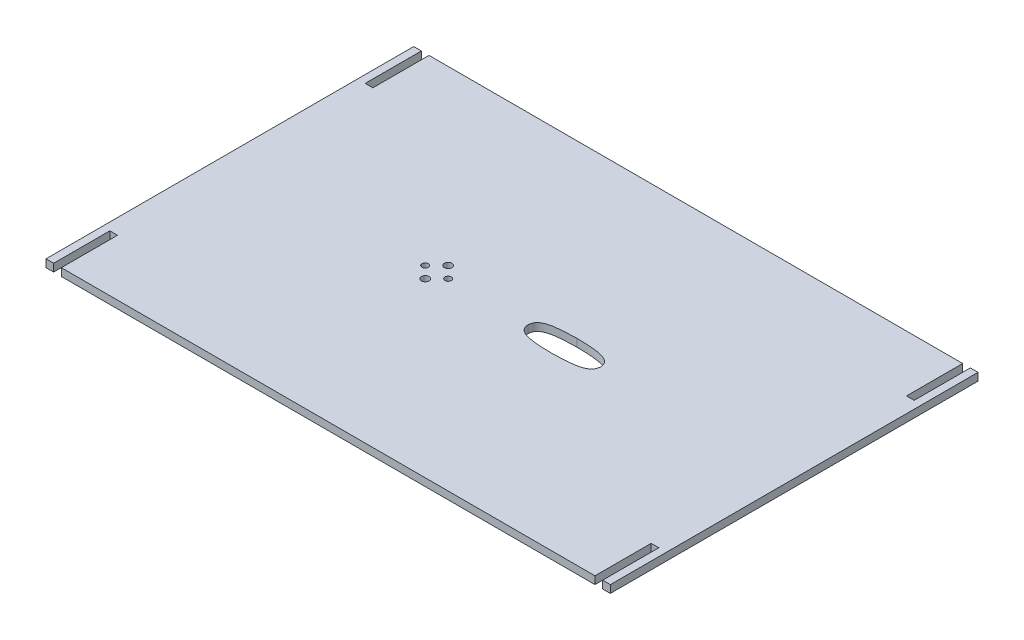
ISO-10303-21;
HEADER;
FILE_DESCRIPTION(('STEP AP214'),'2;1');
FILE_NAME('part.step','',(''),(''),'','','');
FILE_SCHEMA(('AUTOMOTIVE_DESIGN { 1 0 10303 214 1 1 1 1 }'));
ENDSEC;
DATA;
#1=APPLICATION_CONTEXT('core data for automotive mechanical design processes');
#2=APPLICATION_PROTOCOL_DEFINITION('international standard','automotive_design',2000,#1);
#3=PRODUCT_CONTEXT('',#1,'mechanical');
#4=PRODUCT('Part','Part','',(#3));
#5=PRODUCT_RELATED_PRODUCT_CATEGORY('part','',(#4));
#6=PRODUCT_DEFINITION_FORMATION('','',#4);
#7=PRODUCT_DEFINITION_CONTEXT('part definition',#1,'design');
#8=PRODUCT_DEFINITION('design','',#6,#7);
#9=PRODUCT_DEFINITION_SHAPE('','',#8);
#10=(LENGTH_UNIT() NAMED_UNIT(*) SI_UNIT(.MILLI.,.METRE.));
#11=(NAMED_UNIT(*) PLANE_ANGLE_UNIT() SI_UNIT($,.RADIAN.));
#12=(NAMED_UNIT(*) SI_UNIT($,.STERADIAN.) SOLID_ANGLE_UNIT());
#13=UNCERTAINTY_MEASURE_WITH_UNIT(LENGTH_MEASURE(1.E-05),#10,'distance_accuracy_value','');
#14=(GEOMETRIC_REPRESENTATION_CONTEXT(3) GLOBAL_UNCERTAINTY_ASSIGNED_CONTEXT((#13)) GLOBAL_UNIT_ASSIGNED_CONTEXT((#10,
#11,#12)) REPRESENTATION_CONTEXT('',''));
#15=CARTESIAN_POINT('',(0.,0.,0.));
#16=DIRECTION('',(0.,0.,1.));
#17=DIRECTION('',(1.,0.,0.));
#18=AXIS2_PLACEMENT_3D('',#15,#16,#17);
#19=CARTESIAN_POINT('',(3.14071685325601E-11,6.,-43.9999999999758));
#20=DIRECTION('',(1.,0.,0.));
#21=DIRECTION('',(0.,0.,-1.));
#22=AXIS2_PLACEMENT_3D('',#19,#20,#21);
#23=PLANE('',#22);
#24=DIRECTION('',(0.,0.,1.));
#25=VECTOR('',#24,1.);
#26=CARTESIAN_POINT('',(3.14071685325601E-11,0.,-43.9999999999758));
#27=LINE('',#26,#25);
#28=CARTESIAN_POINT('',(3.14071685325601E-11,0.,-43.9999999999758));
#29=VERTEX_POINT('',#28);
#30=CARTESIAN_POINT('',(3.14124717823535E-11,0.,-1.20459198171829E-11));
#31=VERTEX_POINT('',#30);
#32=EDGE_CURVE('E366',#29,#31,#27,.T.);
#33=ORIENTED_EDGE('',*,*,#32,.T.);
#34=DIRECTION('',(0.,-1.,0.));
#35=VECTOR('',#34,1.);
#36=CARTESIAN_POINT('',(3.14124717823535E-11,6.,-1.20459198171829E-11));
#37=LINE('',#36,#35);
#38=CARTESIAN_POINT('',(3.14124717823535E-11,6.,-1.20459198171829E-11));
#39=VERTEX_POINT('',#38);
#40=EDGE_CURVE('E11',#39,#31,#37,.T.);
#41=ORIENTED_EDGE('',*,*,#40,.F.);
#42=DIRECTION('',(0.,0.,1.));
#43=VECTOR('',#42,1.);
#44=CARTESIAN_POINT('',(3.14071685325601E-11,6.,-43.9999999999758));
#45=LINE('',#44,#43);
#46=CARTESIAN_POINT('',(3.14071685325601E-11,6.,-43.9999999999758));
#47=VERTEX_POINT('',#46);
#48=EDGE_CURVE('E411',#47,#39,#45,.T.);
#49=ORIENTED_EDGE('',*,*,#48,.F.);
#50=DIRECTION('',(0.,-1.,0.));
#51=VECTOR('',#50,1.);
#52=CARTESIAN_POINT('',(3.14071685325601E-11,6.,-43.9999999999758));
#53=LINE('',#52,#51);
#54=EDGE_CURVE('E412',#47,#29,#53,.T.);
#55=ORIENTED_EDGE('',*,*,#54,.T.);
#56=EDGE_LOOP('',(#33,#41,#49,#55));
#57=FACE_BOUND('',#56,.T.);
#58=ADVANCED_FACE('F43',(#57),#23,.F.);
#59=CARTESIAN_POINT('',(3.14124717823535E-11,6.,-1.20459198171829E-11));
#60=DIRECTION('',(0.,0.,-1.));
#61=DIRECTION('',(-1.,0.,0.));
#62=AXIS2_PLACEMENT_3D('',#59,#60,#61);
#63=PLANE('',#62);
#64=DIRECTION('',(1.,0.,0.));
#65=VECTOR('',#64,1.);
#66=CARTESIAN_POINT('',(3.14124717823535E-11,0.,-1.20459198171829E-11));
#67=LINE('',#66,#65);
#68=CARTESIAN_POINT('',(418.000000000031,0.,0.));
#69=VERTEX_POINT('',#68);
#70=EDGE_CURVE('E357',#31,#69,#67,.T.);
#71=ORIENTED_EDGE('',*,*,#70,.T.);
#72=DIRECTION('',(0.,-1.,0.));
#73=VECTOR('',#72,1.);
#74=CARTESIAN_POINT('',(418.000000000031,6.,0.));
#75=LINE('',#74,#73);
#76=CARTESIAN_POINT('',(418.000000000031,6.,0.));
#77=VERTEX_POINT('',#76);
#78=EDGE_CURVE('E50',#77,#69,#75,.T.);
#79=ORIENTED_EDGE('',*,*,#78,.F.);
#80=DIRECTION('',(1.,0.,0.));
#81=VECTOR('',#80,1.);
#82=CARTESIAN_POINT('',(3.14124717823535E-11,6.,-1.20459198171829E-11));
#83=LINE('',#82,#81);
#84=EDGE_CURVE('E473',#39,#77,#83,.T.);
#85=ORIENTED_EDGE('',*,*,#84,.F.);
#86=ORIENTED_EDGE('',*,*,#40,.T.);
#87=EDGE_LOOP('',(#71,#79,#85,#86));
#88=FACE_BOUND('',#87,.T.);
#89=ADVANCED_FACE('F348',(#88),#63,.F.);
#90=CARTESIAN_POINT('',(418.000000000031,6.,0.));
#91=DIRECTION('',(-1.,0.,0.));
#92=DIRECTION('',(0.,0.,1.));
#93=AXIS2_PLACEMENT_3D('',#90,#91,#92);
#94=PLANE('',#93);
#95=DIRECTION('',(0.,0.,-1.));
#96=VECTOR('',#95,1.);
#97=CARTESIAN_POINT('',(418.000000000031,0.,0.));
#98=LINE('',#97,#96);
#99=CARTESIAN_POINT('',(418.000000000031,0.,-43.9999999999761));
#100=VERTEX_POINT('',#99);
#101=EDGE_CURVE('E365',#69,#100,#98,.T.);
#102=ORIENTED_EDGE('',*,*,#101,.T.);
#103=DIRECTION('',(0.,-1.,0.));
#104=VECTOR('',#103,1.);
#105=CARTESIAN_POINT('',(418.000000000031,6.,-43.9999999999761));
#106=LINE('',#105,#104);
#107=CARTESIAN_POINT('',(418.000000000031,6.,-43.9999999999761));
#108=VERTEX_POINT('',#107);
#109=EDGE_CURVE('E371',#108,#100,#106,.T.);
#110=ORIENTED_EDGE('',*,*,#109,.F.);
#111=DIRECTION('',(0.,0.,-1.));
#112=VECTOR('',#111,1.);
#113=CARTESIAN_POINT('',(418.000000000031,6.,0.));
#114=LINE('',#113,#112);
#115=EDGE_CURVE('E370',#77,#108,#114,.T.);
#116=ORIENTED_EDGE('',*,*,#115,.F.);
#117=ORIENTED_EDGE('',*,*,#78,.T.);
#118=EDGE_LOOP('',(#102,#110,#116,#117));
#119=FACE_BOUND('',#118,.T.);
#120=ADVANCED_FACE('F345',(#119),#94,.F.);
#121=CARTESIAN_POINT('',(423.999999999984,6.,-43.9999999999761));
#122=DIRECTION('',(0.,0.,-1.));
#123=DIRECTION('',(-1.,0.,0.));
#124=AXIS2_PLACEMENT_3D('',#121,#122,#123);
#125=PLANE('',#124);
#126=DIRECTION('',(1.,0.,0.));
#127=VECTOR('',#126,1.);
#128=CARTESIAN_POINT('',(423.999999999984,0.,-43.9999999999761));
#129=LINE('',#128,#127);
#130=CARTESIAN_POINT('',(423.999999999984,0.,-43.9999999999761));
#131=VERTEX_POINT('',#130);
#132=EDGE_CURVE('E374',#100,#131,#129,.T.);
#133=ORIENTED_EDGE('',*,*,#132,.T.);
#134=DIRECTION('',(0.,-1.,0.));
#135=VECTOR('',#134,1.);
#136=CARTESIAN_POINT('',(423.999999999984,6.,-43.9999999999761));
#137=LINE('',#136,#135);
#138=CARTESIAN_POINT('',(423.999999999984,6.,-43.9999999999761));
#139=VERTEX_POINT('',#138);
#140=EDGE_CURVE('E461',#139,#131,#137,.T.);
#141=ORIENTED_EDGE('',*,*,#140,.F.);
#142=DIRECTION('',(1.,0.,0.));
#143=VECTOR('',#142,1.);
#144=CARTESIAN_POINT('',(423.999999999984,6.,-43.9999999999761));
#145=LINE('',#144,#143);
#146=EDGE_CURVE('E466',#108,#139,#145,.T.);
#147=ORIENTED_EDGE('',*,*,#146,.F.);
#148=ORIENTED_EDGE('',*,*,#109,.T.);
#149=EDGE_LOOP('',(#133,#141,#147,#148));
#150=FACE_BOUND('',#149,.T.);
#151=ADVANCED_FACE('F341',(#150),#125,.F.);
#152=CARTESIAN_POINT('',(423.999999999984,6.,-1.23267613517096E-13));
#153=DIRECTION('',(1.,0.,0.));
#154=DIRECTION('',(0.,0.,-1.));
#155=AXIS2_PLACEMENT_3D('',#152,#153,#154);
#156=PLANE('',#155);
#157=DIRECTION('',(0.,0.,1.));
#158=VECTOR('',#157,1.);
#159=CARTESIAN_POINT('',(423.999999999984,0.,-1.23267613517096E-13));
#160=LINE('',#159,#158);
#161=CARTESIAN_POINT('',(423.999999999984,0.,-1.23267613517096E-13));
#162=VERTEX_POINT('',#161);
#163=EDGE_CURVE('E376',#131,#162,#160,.T.);
#164=ORIENTED_EDGE('',*,*,#163,.T.);
#165=DIRECTION('',(0.,-1.,0.));
#166=VECTOR('',#165,1.);
#167=CARTESIAN_POINT('',(423.999999999984,6.,-1.23267613517096E-13));
#168=LINE('',#167,#166);
#169=CARTESIAN_POINT('',(423.999999999984,6.,-1.23267613517096E-13));
#170=VERTEX_POINT('',#169);
#171=EDGE_CURVE('E458',#170,#162,#168,.T.);
#172=ORIENTED_EDGE('',*,*,#171,.F.);
#173=DIRECTION('',(0.,0.,1.));
#174=VECTOR('',#173,1.);
#175=CARTESIAN_POINT('',(423.999999999984,6.,-1.23267613517096E-13));
#176=LINE('',#175,#174);
#177=EDGE_CURVE('E469',#139,#170,#176,.T.);
#178=ORIENTED_EDGE('',*,*,#177,.F.);
#179=ORIENTED_EDGE('',*,*,#140,.T.);
#180=EDGE_LOOP('',(#164,#172,#178,#179));
#181=FACE_BOUND('',#180,.T.);
#182=ADVANCED_FACE('F337',(#181),#156,.F.);
#183=CARTESIAN_POINT('',(429.999999999984,6.,0.));
#184=DIRECTION('',(0.,0.,-1.));
#185=DIRECTION('',(-1.,0.,0.));
#186=AXIS2_PLACEMENT_3D('',#183,#184,#185);
#187=PLANE('',#186);
#188=DIRECTION('',(1.,0.,0.));
#189=VECTOR('',#188,1.);
#190=CARTESIAN_POINT('',(429.999999999984,0.,0.));
#191=LINE('',#190,#189);
#192=CARTESIAN_POINT('',(429.999999999984,0.,0.));
#193=VERTEX_POINT('',#192);
#194=EDGE_CURVE('E381',#162,#193,#191,.T.);
#195=ORIENTED_EDGE('',*,*,#194,.T.);
#196=DIRECTION('',(0.,-1.,0.));
#197=VECTOR('',#196,1.);
#198=CARTESIAN_POINT('',(429.999999999984,6.,0.));
#199=LINE('',#198,#197);
#200=CARTESIAN_POINT('',(429.999999999984,6.,0.));
#201=VERTEX_POINT('',#200);
#202=EDGE_CURVE('E455',#201,#193,#199,.T.);
#203=ORIENTED_EDGE('',*,*,#202,.F.);
#204=DIRECTION('',(1.,0.,0.));
#205=VECTOR('',#204,1.);
#206=CARTESIAN_POINT('',(429.999999999984,6.,0.));
#207=LINE('',#206,#205);
#208=EDGE_CURVE('E471',#170,#201,#207,.T.);
#209=ORIENTED_EDGE('',*,*,#208,.F.);
#210=ORIENTED_EDGE('',*,*,#171,.T.);
#211=EDGE_LOOP('',(#195,#203,#209,#210));
#212=FACE_BOUND('',#211,.T.);
#213=ADVANCED_FACE('F333',(#212),#187,.F.);
#214=CARTESIAN_POINT('',(429.999999999984,6.,-287.999999999946));
#215=DIRECTION('',(-1.,0.,0.));
#216=DIRECTION('',(0.,0.,1.));
#217=AXIS2_PLACEMENT_3D('',#214,#215,#216);
#218=PLANE('',#217);
#219=DIRECTION('',(0.,0.,-1.));
#220=VECTOR('',#219,1.);
#221=CARTESIAN_POINT('',(429.999999999984,0.,-287.999999999946));
#222=LINE('',#221,#220);
#223=CARTESIAN_POINT('',(429.999999999984,0.,-287.999999999946));
#224=VERTEX_POINT('',#223);
#225=EDGE_CURVE('E383',#193,#224,#222,.T.);
#226=ORIENTED_EDGE('',*,*,#225,.T.);
#227=DIRECTION('',(0.,-1.,0.));
#228=VECTOR('',#227,1.);
#229=CARTESIAN_POINT('',(429.999999999984,6.,-287.999999999946));
#230=LINE('',#229,#228);
#231=CARTESIAN_POINT('',(429.999999999984,6.,-287.999999999946));
#232=VERTEX_POINT('',#231);
#233=EDGE_CURVE('E452',#232,#224,#230,.T.);
#234=ORIENTED_EDGE('',*,*,#233,.F.);
#235=DIRECTION('',(0.,0.,-1.));
#236=VECTOR('',#235,1.);
#237=CARTESIAN_POINT('',(429.999999999984,6.,-287.999999999946));
#238=LINE('',#237,#236);
#239=EDGE_CURVE('E478',#201,#232,#238,.T.);
#240=ORIENTED_EDGE('',*,*,#239,.F.);
#241=ORIENTED_EDGE('',*,*,#202,.T.);
#242=EDGE_LOOP('',(#226,#234,#240,#241));
#243=FACE_BOUND('',#242,.T.);
#244=ADVANCED_FACE('F329',(#243),#218,.F.);
#245=CARTESIAN_POINT('',(423.999999999984,6.,-287.999999999946));
#246=DIRECTION('',(0.,0.,1.));
#247=DIRECTION('',(1.,0.,0.));
#248=AXIS2_PLACEMENT_3D('',#245,#246,#247);
#249=PLANE('',#248);
#250=DIRECTION('',(-1.,0.,0.));
#251=VECTOR('',#250,1.);
#252=CARTESIAN_POINT('',(423.999999999984,0.,-287.999999999946));
#253=LINE('',#252,#251);
#254=CARTESIAN_POINT('',(423.999999999984,0.,-287.999999999946));
#255=VERTEX_POINT('',#254);
#256=EDGE_CURVE('E385',#224,#255,#253,.T.);
#257=ORIENTED_EDGE('',*,*,#256,.T.);
#258=DIRECTION('',(0.,-1.,0.));
#259=VECTOR('',#258,1.);
#260=CARTESIAN_POINT('',(423.999999999984,6.,-287.999999999946));
#261=LINE('',#260,#259);
#262=CARTESIAN_POINT('',(423.999999999984,6.,-287.999999999946));
#263=VERTEX_POINT('',#262);
#264=EDGE_CURVE('E449',#263,#255,#261,.T.);
#265=ORIENTED_EDGE('',*,*,#264,.F.);
#266=DIRECTION('',(-1.,0.,0.));
#267=VECTOR('',#266,1.);
#268=CARTESIAN_POINT('',(423.999999999984,6.,-287.999999999946));
#269=LINE('',#268,#267);
#270=EDGE_CURVE('E480',#232,#263,#269,.T.);
#271=ORIENTED_EDGE('',*,*,#270,.F.);
#272=ORIENTED_EDGE('',*,*,#233,.T.);
#273=EDGE_LOOP('',(#257,#265,#271,#272));
#274=FACE_BOUND('',#273,.T.);
#275=ADVANCED_FACE('F325',(#274),#249,.F.);
#276=CARTESIAN_POINT('',(423.999999999984,6.,-243.99999999997));
#277=DIRECTION('',(1.,0.,0.));
#278=DIRECTION('',(0.,0.,-1.));
#279=AXIS2_PLACEMENT_3D('',#276,#277,#278);
#280=PLANE('',#279);
#281=DIRECTION('',(0.,0.,1.));
#282=VECTOR('',#281,1.);
#283=CARTESIAN_POINT('',(423.999999999984,0.,-243.99999999997));
#284=LINE('',#283,#282);
#285=CARTESIAN_POINT('',(423.999999999984,0.,-243.99999999997));
#286=VERTEX_POINT('',#285);
#287=EDGE_CURVE('E387',#255,#286,#284,.T.);
#288=ORIENTED_EDGE('',*,*,#287,.T.);
#289=DIRECTION('',(0.,-1.,0.));
#290=VECTOR('',#289,1.);
#291=CARTESIAN_POINT('',(423.999999999984,6.,-243.99999999997));
#292=LINE('',#291,#290);
#293=CARTESIAN_POINT('',(423.999999999984,6.,-243.99999999997));
#294=VERTEX_POINT('',#293);
#295=EDGE_CURVE('E446',#294,#286,#292,.T.);
#296=ORIENTED_EDGE('',*,*,#295,.F.);
#297=DIRECTION('',(0.,0.,1.));
#298=VECTOR('',#297,1.);
#299=CARTESIAN_POINT('',(423.999999999984,6.,-243.99999999997));
#300=LINE('',#299,#298);
#301=EDGE_CURVE('E482',#263,#294,#300,.T.);
#302=ORIENTED_EDGE('',*,*,#301,.F.);
#303=ORIENTED_EDGE('',*,*,#264,.T.);
#304=EDGE_LOOP('',(#288,#296,#302,#303));
#305=FACE_BOUND('',#304,.T.);
#306=ADVANCED_FACE('F321',(#305),#280,.F.);
#307=CARTESIAN_POINT('',(417.999999999968,6.,-243.99999999997));
#308=DIRECTION('',(0.,0.,1.));
#309=DIRECTION('',(1.,0.,0.));
#310=AXIS2_PLACEMENT_3D('',#307,#308,#309);
#311=PLANE('',#310);
#312=DIRECTION('',(-1.,0.,0.));
#313=VECTOR('',#312,1.);
#314=CARTESIAN_POINT('',(417.999999999968,0.,-243.99999999997));
#315=LINE('',#314,#313);
#316=CARTESIAN_POINT('',(417.999999999968,0.,-243.99999999997));
#317=VERTEX_POINT('',#316);
#318=EDGE_CURVE('E389',#286,#317,#315,.T.);
#319=ORIENTED_EDGE('',*,*,#318,.T.);
#320=DIRECTION('',(0.,-1.,0.));
#321=VECTOR('',#320,1.);
#322=CARTESIAN_POINT('',(417.999999999968,6.,-243.99999999997));
#323=LINE('',#322,#321);
#324=CARTESIAN_POINT('',(417.999999999968,6.,-243.99999999997));
#325=VERTEX_POINT('',#324);
#326=EDGE_CURVE('E443',#325,#317,#323,.T.);
#327=ORIENTED_EDGE('',*,*,#326,.F.);
#328=DIRECTION('',(-1.,0.,0.));
#329=VECTOR('',#328,1.);
#330=CARTESIAN_POINT('',(417.999999999968,6.,-243.99999999997));
#331=LINE('',#330,#329);
#332=EDGE_CURVE('E484',#294,#325,#331,.T.);
#333=ORIENTED_EDGE('',*,*,#332,.F.);
#334=ORIENTED_EDGE('',*,*,#295,.T.);
#335=EDGE_LOOP('',(#319,#327,#333,#334));
#336=FACE_BOUND('',#335,.T.);
#337=ADVANCED_FACE('F317',(#336),#311,.F.);
#338=CARTESIAN_POINT('',(417.999999999968,6.,-243.99999999997));
#339=DIRECTION('',(-1.,0.,0.));
#340=DIRECTION('',(0.,0.,1.));
#341=AXIS2_PLACEMENT_3D('',#338,#339,#340);
#342=PLANE('',#341);
#343=DIRECTION('',(0.,0.,-1.));
#344=VECTOR('',#343,1.);
#345=CARTESIAN_POINT('',(417.999999999968,0.,-243.99999999997));
#346=LINE('',#345,#344);
#347=CARTESIAN_POINT('',(417.999999999968,0.,-287.999999999946));
#348=VERTEX_POINT('',#347);
#349=EDGE_CURVE('E391',#317,#348,#346,.T.);
#350=ORIENTED_EDGE('',*,*,#349,.T.);
#351=DIRECTION('',(0.,-1.,0.));
#352=VECTOR('',#351,1.);
#353=CARTESIAN_POINT('',(417.999999999968,6.,-287.999999999946));
#354=LINE('',#353,#352);
#355=CARTESIAN_POINT('',(417.999999999968,6.,-287.999999999946));
#356=VERTEX_POINT('',#355);
#357=EDGE_CURVE('E440',#356,#348,#354,.T.);
#358=ORIENTED_EDGE('',*,*,#357,.F.);
#359=DIRECTION('',(0.,0.,-1.));
#360=VECTOR('',#359,1.);
#361=CARTESIAN_POINT('',(417.999999999968,6.,-243.99999999997));
#362=LINE('',#361,#360);
#363=EDGE_CURVE('E486',#325,#356,#362,.T.);
#364=ORIENTED_EDGE('',*,*,#363,.F.);
#365=ORIENTED_EDGE('',*,*,#326,.T.);
#366=EDGE_LOOP('',(#350,#358,#364,#365));
#367=FACE_BOUND('',#366,.T.);
#368=ADVANCED_FACE('F313',(#367),#342,.F.);
#369=CARTESIAN_POINT('',(-3.18105047136071E-11,6.,-287.999999999946));
#370=DIRECTION('',(0.,0.,1.));
#371=DIRECTION('',(1.,0.,0.));
#372=AXIS2_PLACEMENT_3D('',#369,#370,#371);
#373=PLANE('',#372);
#374=DIRECTION('',(-1.,0.,0.));
#375=VECTOR('',#374,1.);
#376=CARTESIAN_POINT('',(-3.18105047136071E-11,0.,-287.999999999946));
#377=LINE('',#376,#375);
#378=CARTESIAN_POINT('',(-3.18105047136071E-11,0.,-287.999999999946));
#379=VERTEX_POINT('',#378);
#380=EDGE_CURVE('E393',#348,#379,#377,.T.);
#381=ORIENTED_EDGE('',*,*,#380,.T.);
#382=DIRECTION('',(0.,-1.,0.));
#383=VECTOR('',#382,1.);
#384=CARTESIAN_POINT('',(-3.18105047136071E-11,6.,-287.999999999946));
#385=LINE('',#384,#383);
#386=CARTESIAN_POINT('',(-3.18105047136071E-11,6.,-287.999999999946));
#387=VERTEX_POINT('',#386);
#388=EDGE_CURVE('E437',#387,#379,#385,.T.);
#389=ORIENTED_EDGE('',*,*,#388,.F.);
#390=DIRECTION('',(-1.,0.,0.));
#391=VECTOR('',#390,1.);
#392=CARTESIAN_POINT('',(-3.18105047136071E-11,6.,-287.999999999946));
#393=LINE('',#392,#391);
#394=EDGE_CURVE('E488',#356,#387,#393,.T.);
#395=ORIENTED_EDGE('',*,*,#394,.F.);
#396=ORIENTED_EDGE('',*,*,#357,.T.);
#397=EDGE_LOOP('',(#381,#389,#395,#396));
#398=FACE_BOUND('',#397,.T.);
#399=ADVANCED_FACE('F309',(#398),#373,.F.);
#400=CARTESIAN_POINT('',(-3.18105047136071E-11,6.,-287.999999999946));
#401=DIRECTION('',(1.,0.,0.));
#402=DIRECTION('',(0.,0.,-1.));
#403=AXIS2_PLACEMENT_3D('',#400,#401,#402);
#404=PLANE('',#403);
#405=DIRECTION('',(0.,0.,1.));
#406=VECTOR('',#405,1.);
#407=CARTESIAN_POINT('',(-3.18105047136071E-11,0.,-287.999999999946));
#408=LINE('',#407,#406);
#409=CARTESIAN_POINT('',(-3.18051162676908E-11,0.,-243.999999999724));
#410=VERTEX_POINT('',#409);
#411=EDGE_CURVE('E395',#379,#410,#408,.T.);
#412=ORIENTED_EDGE('',*,*,#411,.T.);
#413=DIRECTION('',(0.,-1.,0.));
#414=VECTOR('',#413,1.);
#415=CARTESIAN_POINT('',(-3.18051162676908E-11,6.,-243.999999999724));
#416=LINE('',#415,#414);
#417=CARTESIAN_POINT('',(-3.18051162676908E-11,6.,-243.999999999724));
#418=VERTEX_POINT('',#417);
#419=EDGE_CURVE('E434',#418,#410,#416,.T.);
#420=ORIENTED_EDGE('',*,*,#419,.F.);
#421=DIRECTION('',(0.,0.,1.));
#422=VECTOR('',#421,1.);
#423=CARTESIAN_POINT('',(-3.18105047136071E-11,6.,-287.999999999946));
#424=LINE('',#423,#422);
#425=EDGE_CURVE('E490',#387,#418,#424,.T.);
#426=ORIENTED_EDGE('',*,*,#425,.F.);
#427=ORIENTED_EDGE('',*,*,#388,.T.);
#428=EDGE_LOOP('',(#412,#420,#426,#427));
#429=FACE_BOUND('',#428,.T.);
#430=ADVANCED_FACE('F305',(#429),#404,.F.);
#431=CARTESIAN_POINT('',(-3.18051162676908E-11,6.,-243.999999999724));
#432=DIRECTION('',(0.,0.,1.));
#433=DIRECTION('',(1.,0.,0.));
#434=AXIS2_PLACEMENT_3D('',#431,#432,#433);
#435=PLANE('',#434);
#436=DIRECTION('',(-1.,0.,0.));
#437=VECTOR('',#436,1.);
#438=CARTESIAN_POINT('',(-3.18051162676908E-11,0.,-243.999999999724));
#439=LINE('',#438,#437);
#440=CARTESIAN_POINT('',(-6.0000000000478,0.,-243.999999999724));
#441=VERTEX_POINT('',#440);
#442=EDGE_CURVE('E397',#410,#441,#439,.T.);
#443=ORIENTED_EDGE('',*,*,#442,.T.);
#444=DIRECTION('',(0.,-1.,0.));
#445=VECTOR('',#444,1.);
#446=CARTESIAN_POINT('',(-6.0000000000478,6.,-243.999999999724));
#447=LINE('',#446,#445);
#448=CARTESIAN_POINT('',(-6.0000000000478,6.,-243.999999999724));
#449=VERTEX_POINT('',#448);
#450=EDGE_CURVE('E431',#449,#441,#447,.T.);
#451=ORIENTED_EDGE('',*,*,#450,.F.);
#452=DIRECTION('',(-1.,0.,0.));
#453=VECTOR('',#452,1.);
#454=CARTESIAN_POINT('',(-3.18051162676908E-11,6.,-243.999999999724));
#455=LINE('',#454,#453);
#456=EDGE_CURVE('E492',#418,#449,#455,.T.);
#457=ORIENTED_EDGE('',*,*,#456,.F.);
#458=ORIENTED_EDGE('',*,*,#419,.T.);
#459=EDGE_LOOP('',(#443,#451,#457,#458));
#460=FACE_BOUND('',#459,.T.);
#461=ADVANCED_FACE('F301',(#460),#435,.F.);
#462=CARTESIAN_POINT('',(-6.0000000000478,6.,-243.999999999724));
#463=DIRECTION('',(-1.,0.,0.));
#464=DIRECTION('',(0.,0.,1.));
#465=AXIS2_PLACEMENT_3D('',#462,#463,#464);
#466=PLANE('',#465);
#467=DIRECTION('',(0.,0.,-1.));
#468=VECTOR('',#467,1.);
#469=CARTESIAN_POINT('',(-6.0000000000478,0.,-243.999999999724));
#470=LINE('',#469,#468);
#471=CARTESIAN_POINT('',(-6.0000000000478,0.,-287.999999999946));
#472=VERTEX_POINT('',#471);
#473=EDGE_CURVE('E399',#441,#472,#470,.T.);
#474=ORIENTED_EDGE('',*,*,#473,.T.);
#475=DIRECTION('',(0.,-1.,0.));
#476=VECTOR('',#475,1.);
#477=CARTESIAN_POINT('',(-6.0000000000478,6.,-287.999999999946));
#478=LINE('',#477,#476);
#479=CARTESIAN_POINT('',(-6.0000000000478,6.,-287.999999999946));
#480=VERTEX_POINT('',#479);
#481=EDGE_CURVE('E428',#480,#472,#478,.T.);
#482=ORIENTED_EDGE('',*,*,#481,.F.);
#483=DIRECTION('',(0.,0.,-1.));
#484=VECTOR('',#483,1.);
#485=CARTESIAN_POINT('',(-6.0000000000478,6.,-243.999999999724));
#486=LINE('',#485,#484);
#487=EDGE_CURVE('E494',#449,#480,#486,.T.);
#488=ORIENTED_EDGE('',*,*,#487,.F.);
#489=ORIENTED_EDGE('',*,*,#450,.T.);
#490=EDGE_LOOP('',(#474,#482,#488,#489));
#491=FACE_BOUND('',#490,.T.);
#492=ADVANCED_FACE('F297',(#491),#466,.F.);
#493=CARTESIAN_POINT('',(-6.0000000000478,6.,-287.999999999946));
#494=DIRECTION('',(0.,0.,1.));
#495=DIRECTION('',(1.,0.,0.));
#496=AXIS2_PLACEMENT_3D('',#493,#494,#495);
#497=PLANE('',#496);
#498=DIRECTION('',(-1.,0.,0.));
#499=VECTOR('',#498,1.);
#500=CARTESIAN_POINT('',(-6.0000000000478,0.,-287.999999999946));
#501=LINE('',#500,#499);
#502=CARTESIAN_POINT('',(-12.0000000000478,0.,-287.999999999946));
#503=VERTEX_POINT('',#502);
#504=EDGE_CURVE('E401',#472,#503,#501,.T.);
#505=ORIENTED_EDGE('',*,*,#504,.T.);
#506=DIRECTION('',(0.,-1.,0.));
#507=VECTOR('',#506,1.);
#508=CARTESIAN_POINT('',(-12.0000000000478,6.,-287.999999999946));
#509=LINE('',#508,#507);
#510=CARTESIAN_POINT('',(-12.0000000000478,6.,-287.999999999946));
#511=VERTEX_POINT('',#510);
#512=EDGE_CURVE('E425',#511,#503,#509,.T.);
#513=ORIENTED_EDGE('',*,*,#512,.F.);
#514=DIRECTION('',(-1.,0.,0.));
#515=VECTOR('',#514,1.);
#516=CARTESIAN_POINT('',(-6.0000000000478,6.,-287.999999999946));
#517=LINE('',#516,#515);
#518=EDGE_CURVE('E496',#480,#511,#517,.T.);
#519=ORIENTED_EDGE('',*,*,#518,.F.);
#520=ORIENTED_EDGE('',*,*,#481,.T.);
#521=EDGE_LOOP('',(#505,#513,#519,#520));
#522=FACE_BOUND('',#521,.T.);
#523=ADVANCED_FACE('F293',(#522),#497,.F.);
#524=CARTESIAN_POINT('',(-12.0000000000478,6.,-287.999999999946));
#525=DIRECTION('',(1.,0.,0.));
#526=DIRECTION('',(0.,0.,-1.));
#527=AXIS2_PLACEMENT_3D('',#524,#525,#526);
#528=PLANE('',#527);
#529=DIRECTION('',(0.,0.,1.));
#530=VECTOR('',#529,1.);
#531=CARTESIAN_POINT('',(-12.0000000000478,0.,-287.999999999946));
#532=LINE('',#531,#530);
#533=CARTESIAN_POINT('',(-12.0000000000478,0.,0.));
#534=VERTEX_POINT('',#533);
#535=EDGE_CURVE('E403',#503,#534,#532,.T.);
#536=ORIENTED_EDGE('',*,*,#535,.T.);
#537=DIRECTION('',(0.,-1.,0.));
#538=VECTOR('',#537,1.);
#539=CARTESIAN_POINT('',(-12.0000000000478,6.,0.));
#540=LINE('',#539,#538);
#541=CARTESIAN_POINT('',(-12.0000000000478,6.,0.));
#542=VERTEX_POINT('',#541);
#543=EDGE_CURVE('E422',#542,#534,#540,.T.);
#544=ORIENTED_EDGE('',*,*,#543,.F.);
#545=DIRECTION('',(0.,0.,1.));
#546=VECTOR('',#545,1.);
#547=CARTESIAN_POINT('',(-12.0000000000478,6.,-287.999999999946));
#548=LINE('',#547,#546);
#549=EDGE_CURVE('E498',#511,#542,#548,.T.);
#550=ORIENTED_EDGE('',*,*,#549,.F.);
#551=ORIENTED_EDGE('',*,*,#512,.T.);
#552=EDGE_LOOP('',(#536,#544,#550,#551));
#553=FACE_BOUND('',#552,.T.);
#554=ADVANCED_FACE('F289',(#553),#528,.F.);
#555=CARTESIAN_POINT('',(-5.99999999998462,6.,0.));
#556=DIRECTION('',(0.,0.,-1.));
#557=DIRECTION('',(-1.,0.,0.));
#558=AXIS2_PLACEMENT_3D('',#555,#556,#557);
#559=PLANE('',#558);
#560=DIRECTION('',(1.,0.,0.));
#561=VECTOR('',#560,1.);
#562=CARTESIAN_POINT('',(-5.99999999998462,0.,0.));
#563=LINE('',#562,#561);
#564=CARTESIAN_POINT('',(-5.99999999998462,0.,0.));
#565=VERTEX_POINT('',#564);
#566=EDGE_CURVE('E405',#534,#565,#563,.T.);
#567=ORIENTED_EDGE('',*,*,#566,.T.);
#568=DIRECTION('',(0.,-1.,0.));
#569=VECTOR('',#568,1.);
#570=CARTESIAN_POINT('',(-5.99999999998462,6.,0.));
#571=LINE('',#570,#569);
#572=CARTESIAN_POINT('',(-5.99999999998462,6.,0.));
#573=VERTEX_POINT('',#572);
#574=EDGE_CURVE('E419',#573,#565,#571,.T.);
#575=ORIENTED_EDGE('',*,*,#574,.F.);
#576=DIRECTION('',(1.,0.,0.));
#577=VECTOR('',#576,1.);
#578=CARTESIAN_POINT('',(-5.99999999998462,6.,0.));
#579=LINE('',#578,#577);
#580=EDGE_CURVE('E500',#542,#573,#579,.T.);
#581=ORIENTED_EDGE('',*,*,#580,.F.);
#582=ORIENTED_EDGE('',*,*,#543,.T.);
#583=EDGE_LOOP('',(#567,#575,#581,#582));
#584=FACE_BOUND('',#583,.T.);
#585=ADVANCED_FACE('F285',(#584),#559,.F.);
#586=CARTESIAN_POINT('',(-5.99999999998452,6.,-43.9999999999758));
#587=DIRECTION('',(-1.,0.,0.));
#588=DIRECTION('',(0.,0.,1.));
#589=AXIS2_PLACEMENT_3D('',#586,#587,#588);
#590=PLANE('',#589);
#591=DIRECTION('',(0.,0.,-1.));
#592=VECTOR('',#591,1.);
#593=CARTESIAN_POINT('',(-5.99999999998452,0.,-43.9999999999758));
#594=LINE('',#593,#592);
#595=CARTESIAN_POINT('',(-5.99999999998452,0.,-43.9999999999758));
#596=VERTEX_POINT('',#595);
#597=EDGE_CURVE('E407',#565,#596,#594,.T.);
#598=ORIENTED_EDGE('',*,*,#597,.T.);
#599=DIRECTION('',(0.,-1.,0.));
#600=VECTOR('',#599,1.);
#601=CARTESIAN_POINT('',(-5.99999999998452,6.,-43.9999999999758));
#602=LINE('',#601,#600);
#603=CARTESIAN_POINT('',(-5.99999999998452,6.,-43.9999999999758));
#604=VERTEX_POINT('',#603);
#605=EDGE_CURVE('E415',#604,#596,#602,.T.);
#606=ORIENTED_EDGE('',*,*,#605,.F.);
#607=DIRECTION('',(0.,0.,-1.));
#608=VECTOR('',#607,1.);
#609=CARTESIAN_POINT('',(-5.99999999998452,6.,-43.9999999999758));
#610=LINE('',#609,#608);
#611=EDGE_CURVE('E502',#573,#604,#610,.T.);
#612=ORIENTED_EDGE('',*,*,#611,.F.);
#613=ORIENTED_EDGE('',*,*,#574,.T.);
#614=EDGE_LOOP('',(#598,#606,#612,#613));
#615=FACE_BOUND('',#614,.T.);
#616=ADVANCED_FACE('F281',(#615),#590,.F.);
#617=CARTESIAN_POINT('',(-5.99999999998452,6.,-43.9999999999758));
#618=DIRECTION('',(0.,0.,-1.));
#619=DIRECTION('',(-1.,0.,0.));
#620=AXIS2_PLACEMENT_3D('',#617,#618,#619);
#621=PLANE('',#620);
#622=DIRECTION('',(1.,0.,0.));
#623=VECTOR('',#622,1.);
#624=CARTESIAN_POINT('',(-5.99999999998452,0.,-43.9999999999758));
#625=LINE('',#624,#623);
#626=EDGE_CURVE('E409',#596,#29,#625,.T.);
#627=ORIENTED_EDGE('',*,*,#626,.T.);
#628=ORIENTED_EDGE('',*,*,#54,.F.);
#629=DIRECTION('',(1.,0.,0.));
#630=VECTOR('',#629,1.);
#631=CARTESIAN_POINT('',(-5.99999999998452,6.,-43.9999999999758));
#632=LINE('',#631,#630);
#633=EDGE_CURVE('E416',#604,#47,#632,.T.);
#634=ORIENTED_EDGE('',*,*,#633,.F.);
#635=ORIENTED_EDGE('',*,*,#605,.T.);
#636=EDGE_LOOP('',(#627,#628,#634,#635));
#637=FACE_BOUND('',#636,.T.);
#638=ADVANCED_FACE('F274',(#637),#621,.F.);
#639=CARTESIAN_POINT('',(0.,6.,0.));
#640=DIRECTION('',(0.,1.,0.));
#641=DIRECTION('',(0.,0.,1.));
#642=AXIS2_PLACEMENT_3D('',#639,#640,#641);
#643=PLANE('',#642);
#644=CARTESIAN_POINT('',(149.999999999984,6.,-152.999999999946));
#645=DIRECTION('',(0.,1.,0.));
#646=DIRECTION('',(0.,0.,1.));
#647=AXIS2_PLACEMENT_3D('',#644,#645,#646);
#648=CIRCLE('',#647,2.99999999999999);
#649=CARTESIAN_POINT('',(149.999999999984,6.,-149.999999999946));
#650=VERTEX_POINT('',#649);
#651=EDGE_CURVE('E511',#650,#650,#648,.T.);
#652=ORIENTED_EDGE('',*,*,#651,.F.);
#653=EDGE_LOOP('',(#652));
#654=FACE_BOUND('',#653,.T.);
#655=CARTESIAN_POINT('',(158.999999999984,6.,-143.999999999946));
#656=DIRECTION('',(0.,1.,0.));
#657=DIRECTION('',(0.,0.,1.));
#658=AXIS2_PLACEMENT_3D('',#655,#656,#657);
#659=CIRCLE('',#658,2.5);
#660=CARTESIAN_POINT('',(158.999999999984,6.,-141.499999999946));
#661=VERTEX_POINT('',#660);
#662=EDGE_CURVE('E566',#661,#661,#659,.T.);
#663=ORIENTED_EDGE('',*,*,#662,.F.);
#664=EDGE_LOOP('',(#663));
#665=FACE_BOUND('',#664,.T.);
#666=CARTESIAN_POINT('',(140.999999999984,6.,-143.999999999946));
#667=DIRECTION('',(0.,1.,0.));
#668=DIRECTION('',(0.,0.,1.));
#669=AXIS2_PLACEMENT_3D('',#666,#667,#668);
#670=CIRCLE('',#669,2.5);
#671=CARTESIAN_POINT('',(140.999999999984,6.,-141.499999999946));
#672=VERTEX_POINT('',#671);
#673=EDGE_CURVE('E227',#672,#672,#670,.T.);
#674=ORIENTED_EDGE('',*,*,#673,.F.);
#675=EDGE_LOOP('',(#674));
#676=FACE_BOUND('',#675,.T.);
#677=CARTESIAN_POINT('',(278.499999999984,6.,-143.999999999946));
#678=CARTESIAN_POINT('',(278.066675751563,6.,-152.446887217056));
#679=CARTESIAN_POINT('',(268.021517603801,6.,-153.66628267857));
#680=CARTESIAN_POINT('',(249.999999999984,6.,-153.999999999946));
#681=B_SPLINE_CURVE_WITH_KNOTS('',3,(#677,#678,#679,#680),.UNSPECIFIED.,.F.,.F.,(4,4),(0.,1.),.UNSPECIFIED.);
#682=CARTESIAN_POINT('',(278.499999999984,6.,-143.999999999946));
#683=VERTEX_POINT('',#682);
#684=CARTESIAN_POINT('',(249.999999999984,6.,-153.999999999946));
#685=VERTEX_POINT('',#684);
#686=EDGE_CURVE('E57',#683,#685,#681,.T.);
#687=ORIENTED_EDGE('',*,*,#686,.F.);
#688=CARTESIAN_POINT('',(249.999999999984,6.,-133.999999999946));
#689=CARTESIAN_POINT('',(268.021517603801,6.,-134.333717321322));
#690=CARTESIAN_POINT('',(278.066675751563,6.,-135.553112782836));
#691=CARTESIAN_POINT('',(278.499999999984,6.,-143.999999999946));
#692=B_SPLINE_CURVE_WITH_KNOTS('',3,(#688,#689,#690,#691),.UNSPECIFIED.,.F.,.F.,(4,4),(0.,1.),.UNSPECIFIED.);
#693=CARTESIAN_POINT('',(249.999999999984,6.,-133.999999999946));
#694=VERTEX_POINT('',#693);
#695=EDGE_CURVE('E212',#694,#683,#692,.T.);
#696=ORIENTED_EDGE('',*,*,#695,.F.);
#697=CARTESIAN_POINT('',(221.499999999984,6.,-143.999999999946));
#698=CARTESIAN_POINT('',(221.933324248405,6.,-135.553112782836));
#699=CARTESIAN_POINT('',(231.978482396167,6.,-134.333717321322));
#700=CARTESIAN_POINT('',(249.999999999984,6.,-133.999999999946));
#701=B_SPLINE_CURVE_WITH_KNOTS('',3,(#697,#698,#699,#700),.UNSPECIFIED.,.F.,.F.,(4,4),(0.,1.),.UNSPECIFIED.);
#702=CARTESIAN_POINT('',(221.499999999984,6.,-143.999999999946));
#703=VERTEX_POINT('',#702);
#704=EDGE_CURVE('E217',#703,#694,#701,.T.);
#705=ORIENTED_EDGE('',*,*,#704,.F.);
#706=CARTESIAN_POINT('',(249.999999999984,6.,-153.999999999946));
#707=CARTESIAN_POINT('',(231.978482396167,6.,-153.66628267857));
#708=CARTESIAN_POINT('',(221.933324248405,6.,-152.446887217056));
#709=CARTESIAN_POINT('',(221.499999999984,6.,-143.999999999946));
#710=B_SPLINE_CURVE_WITH_KNOTS('',3,(#706,#707,#708,#709),.UNSPECIFIED.,.F.,.F.,(4,4),(0.,1.),.UNSPECIFIED.);
#711=EDGE_CURVE('E223',#685,#703,#710,.T.);
#712=ORIENTED_EDGE('',*,*,#711,.F.);
#713=EDGE_LOOP('',(#687,#696,#705,#712));
#714=FACE_BOUND('',#713,.T.);
#715=CARTESIAN_POINT('',(149.999999999984,6.,-134.999999999946));
#716=DIRECTION('',(0.,1.,0.));
#717=DIRECTION('',(0.,0.,1.));
#718=AXIS2_PLACEMENT_3D('',#715,#716,#717);
#719=CIRCLE('',#718,2.99999999999999);
#720=CARTESIAN_POINT('',(149.999999999984,6.,-131.999999999946));
#721=VERTEX_POINT('',#720);
#722=EDGE_CURVE('E506',#721,#721,#719,.T.);
#723=ORIENTED_EDGE('',*,*,#722,.F.);
#724=EDGE_LOOP('',(#723));
#725=FACE_BOUND('',#724,.T.);
#726=ORIENTED_EDGE('',*,*,#48,.T.);
#727=ORIENTED_EDGE('',*,*,#84,.T.);
#728=ORIENTED_EDGE('',*,*,#115,.T.);
#729=ORIENTED_EDGE('',*,*,#146,.T.);
#730=ORIENTED_EDGE('',*,*,#177,.T.);
#731=ORIENTED_EDGE('',*,*,#208,.T.);
#732=ORIENTED_EDGE('',*,*,#239,.T.);
#733=ORIENTED_EDGE('',*,*,#270,.T.);
#734=ORIENTED_EDGE('',*,*,#301,.T.);
#735=ORIENTED_EDGE('',*,*,#332,.T.);
#736=ORIENTED_EDGE('',*,*,#363,.T.);
#737=ORIENTED_EDGE('',*,*,#394,.T.);
#738=ORIENTED_EDGE('',*,*,#425,.T.);
#739=ORIENTED_EDGE('',*,*,#456,.T.);
#740=ORIENTED_EDGE('',*,*,#487,.T.);
#741=ORIENTED_EDGE('',*,*,#518,.T.);
#742=ORIENTED_EDGE('',*,*,#549,.T.);
#743=ORIENTED_EDGE('',*,*,#580,.T.);
#744=ORIENTED_EDGE('',*,*,#611,.T.);
#745=ORIENTED_EDGE('',*,*,#633,.T.);
#746=EDGE_LOOP('',(#726,#727,#728,#729,#730,#731,#732,#733,#734,#735,#736,#737,#738,#739,#740,
#741,#742,#743,#744,#745));
#747=FACE_BOUND('',#746,.T.);
#748=ADVANCED_FACE('F220',(#654,#665,#676,#714,#725,#747),#643,.T.);
#749=CARTESIAN_POINT('',(0.,0.,0.));
#750=DIRECTION('',(0.,1.,0.));
#751=DIRECTION('',(0.,0.,1.));
#752=AXIS2_PLACEMENT_3D('',#749,#750,#751);
#753=PLANE('',#752);
#754=CARTESIAN_POINT('',(149.999999999984,0.,-152.999999999946));
#755=DIRECTION('',(0.,1.,0.));
#756=DIRECTION('',(0.,0.,1.));
#757=AXIS2_PLACEMENT_3D('',#754,#755,#756);
#758=CIRCLE('',#757,2.99999999999999);
#759=CARTESIAN_POINT('',(149.999999999984,0.,-149.999999999946));
#760=VERTEX_POINT('',#759);
#761=EDGE_CURVE('E569',#760,#760,#758,.T.);
#762=ORIENTED_EDGE('',*,*,#761,.T.);
#763=EDGE_LOOP('',(#762));
#764=FACE_BOUND('',#763,.T.);
#765=CARTESIAN_POINT('',(158.999999999984,0.,-143.999999999946));
#766=DIRECTION('',(0.,1.,0.));
#767=DIRECTION('',(0.,0.,1.));
#768=AXIS2_PLACEMENT_3D('',#765,#766,#767);
#769=CIRCLE('',#768,2.5);
#770=CARTESIAN_POINT('',(158.999999999984,0.,-141.499999999946));
#771=VERTEX_POINT('',#770);
#772=EDGE_CURVE('E514',#771,#771,#769,.T.);
#773=ORIENTED_EDGE('',*,*,#772,.T.);
#774=EDGE_LOOP('',(#773));
#775=FACE_BOUND('',#774,.T.);
#776=CARTESIAN_POINT('',(140.999999999984,0.,-143.999999999946));
#777=DIRECTION('',(0.,1.,0.));
#778=DIRECTION('',(0.,0.,1.));
#779=AXIS2_PLACEMENT_3D('',#776,#777,#778);
#780=CIRCLE('',#779,2.5);
#781=CARTESIAN_POINT('',(140.999999999984,0.,-141.499999999946));
#782=VERTEX_POINT('',#781);
#783=EDGE_CURVE('E224',#782,#782,#780,.T.);
#784=ORIENTED_EDGE('',*,*,#783,.T.);
#785=EDGE_LOOP('',(#784));
#786=FACE_BOUND('',#785,.T.);
#787=CARTESIAN_POINT('',(249.999999999984,0.,-133.999999999946));
#788=CARTESIAN_POINT('',(268.021517603801,0.,-134.333717321322));
#789=CARTESIAN_POINT('',(278.066675751563,0.,-135.553112782836));
#790=CARTESIAN_POINT('',(278.499999999984,0.,-143.999999999946));
#791=B_SPLINE_CURVE_WITH_KNOTS('',3,(#787,#788,#789,#790),.UNSPECIFIED.,.F.,.F.,(4,4),(0.,1.),.UNSPECIFIED.);
#792=CARTESIAN_POINT('',(249.999999999984,0.,-133.999999999946));
#793=VERTEX_POINT('',#792);
#794=CARTESIAN_POINT('',(278.499999999984,0.,-143.999999999946));
#795=VERTEX_POINT('',#794);
#796=EDGE_CURVE('E236',#793,#795,#791,.T.);
#797=ORIENTED_EDGE('',*,*,#796,.T.);
#798=CARTESIAN_POINT('',(278.499999999984,0.,-143.999999999946));
#799=CARTESIAN_POINT('',(278.066675751563,0.,-152.446887217056));
#800=CARTESIAN_POINT('',(268.021517603801,0.,-153.66628267857));
#801=CARTESIAN_POINT('',(249.999999999984,0.,-153.999999999946));
#802=B_SPLINE_CURVE_WITH_KNOTS('',3,(#798,#799,#800,#801),.UNSPECIFIED.,.F.,.F.,(4,4),(0.,1.),.UNSPECIFIED.);
#803=CARTESIAN_POINT('',(249.999999999984,0.,-153.999999999946));
#804=VERTEX_POINT('',#803);
#805=EDGE_CURVE('E205',#795,#804,#802,.T.);
#806=ORIENTED_EDGE('',*,*,#805,.T.);
#807=CARTESIAN_POINT('',(249.999999999984,0.,-153.999999999946));
#808=CARTESIAN_POINT('',(231.978482396167,0.,-153.66628267857));
#809=CARTESIAN_POINT('',(221.933324248405,0.,-152.446887217056));
#810=CARTESIAN_POINT('',(221.499999999984,0.,-143.999999999946));
#811=B_SPLINE_CURVE_WITH_KNOTS('',3,(#807,#808,#809,#810),.UNSPECIFIED.,.F.,.F.,(4,4),(0.,1.),.UNSPECIFIED.);
#812=CARTESIAN_POINT('',(221.499999999984,0.,-143.999999999946));
#813=VERTEX_POINT('',#812);
#814=EDGE_CURVE('E577',#804,#813,#811,.T.);
#815=ORIENTED_EDGE('',*,*,#814,.T.);
#816=CARTESIAN_POINT('',(221.499999999984,0.,-143.999999999946));
#817=CARTESIAN_POINT('',(221.933324248405,0.,-135.553112782836));
#818=CARTESIAN_POINT('',(231.978482396167,0.,-134.333717321322));
#819=CARTESIAN_POINT('',(249.999999999984,0.,-133.999999999946));
#820=B_SPLINE_CURVE_WITH_KNOTS('',3,(#816,#817,#818,#819),.UNSPECIFIED.,.F.,.F.,(4,4),(0.,1.),.UNSPECIFIED.);
#821=EDGE_CURVE('E65',#813,#793,#820,.T.);
#822=ORIENTED_EDGE('',*,*,#821,.T.);
#823=EDGE_LOOP('',(#797,#806,#815,#822));
#824=FACE_BOUND('',#823,.T.);
#825=CARTESIAN_POINT('',(149.999999999984,0.,-134.999999999946));
#826=DIRECTION('',(0.,1.,0.));
#827=DIRECTION('',(0.,0.,1.));
#828=AXIS2_PLACEMENT_3D('',#825,#826,#827);
#829=CIRCLE('',#828,2.99999999999999);
#830=CARTESIAN_POINT('',(149.999999999984,0.,-131.999999999946));
#831=VERTEX_POINT('',#830);
#832=EDGE_CURVE('E504',#831,#831,#829,.T.);
#833=ORIENTED_EDGE('',*,*,#832,.T.);
#834=EDGE_LOOP('',(#833));
#835=FACE_BOUND('',#834,.T.);
#836=ORIENTED_EDGE('',*,*,#32,.F.);
#837=ORIENTED_EDGE('',*,*,#626,.F.);
#838=ORIENTED_EDGE('',*,*,#597,.F.);
#839=ORIENTED_EDGE('',*,*,#566,.F.);
#840=ORIENTED_EDGE('',*,*,#535,.F.);
#841=ORIENTED_EDGE('',*,*,#504,.F.);
#842=ORIENTED_EDGE('',*,*,#473,.F.);
#843=ORIENTED_EDGE('',*,*,#442,.F.);
#844=ORIENTED_EDGE('',*,*,#411,.F.);
#845=ORIENTED_EDGE('',*,*,#380,.F.);
#846=ORIENTED_EDGE('',*,*,#349,.F.);
#847=ORIENTED_EDGE('',*,*,#318,.F.);
#848=ORIENTED_EDGE('',*,*,#287,.F.);
#849=ORIENTED_EDGE('',*,*,#256,.F.);
#850=ORIENTED_EDGE('',*,*,#225,.F.);
#851=ORIENTED_EDGE('',*,*,#194,.F.);
#852=ORIENTED_EDGE('',*,*,#163,.F.);
#853=ORIENTED_EDGE('',*,*,#132,.F.);
#854=ORIENTED_EDGE('',*,*,#101,.F.);
#855=ORIENTED_EDGE('',*,*,#70,.F.);
#856=EDGE_LOOP('',(#836,#837,#838,#839,#840,#841,#842,#843,#844,#845,#846,#847,#848,#849,#850,
#851,#852,#853,#854,#855));
#857=FACE_BOUND('',#856,.T.);
#858=ADVANCED_FACE('F270',(#764,#775,#786,#824,#835,#857),#753,.F.);
#859=CARTESIAN_POINT('',(149.999999999984,0.,-134.999999999946));
#860=DIRECTION('',(0.,1.,0.));
#861=DIRECTION('',(0.,0.,1.));
#862=AXIS2_PLACEMENT_3D('',#859,#860,#861);
#863=CYLINDRICAL_SURFACE('',#862,2.99999999999999);
#864=ORIENTED_EDGE('',*,*,#832,.F.);
#865=EDGE_LOOP('',(#864));
#866=FACE_BOUND('',#865,.T.);
#867=ORIENTED_EDGE('',*,*,#722,.T.);
#868=EDGE_LOOP('',(#867));
#869=FACE_BOUND('',#868,.T.);
#870=ADVANCED_FACE('F267',(#866,#869),#863,.F.);
#871=DIRECTION('',(0.,1.,0.));
#872=VECTOR('',#871,1.);
#873=SURFACE_OF_LINEAR_EXTRUSION('',#802,#872);
#874=ORIENTED_EDGE('',*,*,#686,.T.);
#875=DIRECTION('',(0.,1.,0.));
#876=VECTOR('',#875,1.);
#877=CARTESIAN_POINT('',(249.999999999984,0.,-153.999999999946));
#878=LINE('',#877,#876);
#879=EDGE_CURVE('E244',#804,#685,#878,.T.);
#880=ORIENTED_EDGE('',*,*,#879,.F.);
#881=ORIENTED_EDGE('',*,*,#805,.F.);
#882=DIRECTION('',(0.,1.,0.));
#883=VECTOR('',#882,1.);
#884=CARTESIAN_POINT('',(278.499999999984,0.,-143.999999999946));
#885=LINE('',#884,#883);
#886=EDGE_CURVE('E201',#795,#683,#885,.T.);
#887=ORIENTED_EDGE('',*,*,#886,.T.);
#888=EDGE_LOOP('',(#874,#880,#881,#887));
#889=FACE_BOUND('',#888,.T.);
#890=ADVANCED_FACE('F203',(#889),#873,.F.);
#891=DIRECTION('',(0.,1.,0.));
#892=VECTOR('',#891,1.);
#893=SURFACE_OF_LINEAR_EXTRUSION('',#791,#892);
#894=ORIENTED_EDGE('',*,*,#695,.T.);
#895=ORIENTED_EDGE('',*,*,#886,.F.);
#896=ORIENTED_EDGE('',*,*,#796,.F.);
#897=DIRECTION('',(0.,1.,0.));
#898=VECTOR('',#897,1.);
#899=CARTESIAN_POINT('',(249.999999999984,0.,-133.999999999946));
#900=LINE('',#899,#898);
#901=EDGE_CURVE('E209',#793,#694,#900,.T.);
#902=ORIENTED_EDGE('',*,*,#901,.T.);
#903=EDGE_LOOP('',(#894,#895,#896,#902));
#904=FACE_BOUND('',#903,.T.);
#905=ADVANCED_FACE('F213',(#904),#893,.F.);
#906=DIRECTION('',(0.,1.,0.));
#907=VECTOR('',#906,1.);
#908=SURFACE_OF_LINEAR_EXTRUSION('',#820,#907);
#909=ORIENTED_EDGE('',*,*,#704,.T.);
#910=ORIENTED_EDGE('',*,*,#901,.F.);
#911=ORIENTED_EDGE('',*,*,#821,.F.);
#912=DIRECTION('',(0.,1.,0.));
#913=VECTOR('',#912,1.);
#914=CARTESIAN_POINT('',(221.499999999984,0.,-143.999999999946));
#915=LINE('',#914,#913);
#916=EDGE_CURVE('E596',#813,#703,#915,.T.);
#917=ORIENTED_EDGE('',*,*,#916,.T.);
#918=EDGE_LOOP('',(#909,#910,#911,#917));
#919=FACE_BOUND('',#918,.T.);
#920=ADVANCED_FACE('F256',(#919),#908,.F.);
#921=DIRECTION('',(0.,1.,0.));
#922=VECTOR('',#921,1.);
#923=SURFACE_OF_LINEAR_EXTRUSION('',#811,#922);
#924=ORIENTED_EDGE('',*,*,#711,.T.);
#925=ORIENTED_EDGE('',*,*,#916,.F.);
#926=ORIENTED_EDGE('',*,*,#814,.F.);
#927=ORIENTED_EDGE('',*,*,#879,.T.);
#928=EDGE_LOOP('',(#924,#925,#926,#927));
#929=FACE_BOUND('',#928,.T.);
#930=ADVANCED_FACE('F587',(#929),#923,.F.);
#931=CARTESIAN_POINT('',(140.999999999984,0.,-143.999999999946));
#932=DIRECTION('',(0.,1.,0.));
#933=DIRECTION('',(0.,0.,1.));
#934=AXIS2_PLACEMENT_3D('',#931,#932,#933);
#935=CYLINDRICAL_SURFACE('',#934,2.5);
#936=ORIENTED_EDGE('',*,*,#783,.F.);
#937=EDGE_LOOP('',(#936));
#938=FACE_BOUND('',#937,.T.);
#939=ORIENTED_EDGE('',*,*,#673,.T.);
#940=EDGE_LOOP('',(#939));
#941=FACE_BOUND('',#940,.T.);
#942=ADVANCED_FACE('F265',(#938,#941),#935,.F.);
#943=CARTESIAN_POINT('',(158.999999999984,0.,-143.999999999946));
#944=DIRECTION('',(0.,1.,0.));
#945=DIRECTION('',(0.,0.,1.));
#946=AXIS2_PLACEMENT_3D('',#943,#944,#945);
#947=CYLINDRICAL_SURFACE('',#946,2.5);
#948=ORIENTED_EDGE('',*,*,#772,.F.);
#949=EDGE_LOOP('',(#948));
#950=FACE_BOUND('',#949,.T.);
#951=ORIENTED_EDGE('',*,*,#662,.T.);
#952=EDGE_LOOP('',(#951));
#953=FACE_BOUND('',#952,.T.);
#954=ADVANCED_FACE('F261',(#950,#953),#947,.F.);
#955=CARTESIAN_POINT('',(149.999999999984,0.,-152.999999999946));
#956=DIRECTION('',(0.,1.,0.));
#957=DIRECTION('',(0.,0.,1.));
#958=AXIS2_PLACEMENT_3D('',#955,#956,#957);
#959=CYLINDRICAL_SURFACE('',#958,2.99999999999999);
#960=ORIENTED_EDGE('',*,*,#761,.F.);
#961=EDGE_LOOP('',(#960));
#962=FACE_BOUND('',#961,.T.);
#963=ORIENTED_EDGE('',*,*,#651,.T.);
#964=EDGE_LOOP('',(#963));
#965=FACE_BOUND('',#964,.T.);
#966=ADVANCED_FACE('F258',(#962,#965),#959,.F.);
#967=CLOSED_SHELL('',(#58,#89,#120,#151,#182,#213,#244,#275,#306,#337,#368,#399,#430,#461,#492,
#523,#554,#585,#616,#638,#748,#858,#870,#890,#905,#920,#930,#942,#954,#966));
#968=MANIFOLD_SOLID_BREP('B2',#967);
#969=ADVANCED_BREP_SHAPE_REPRESENTATION('',(#18,#968),#14);
#970=SHAPE_DEFINITION_REPRESENTATION(#9,#969);
ENDSEC;
END-ISO-10303-21;
